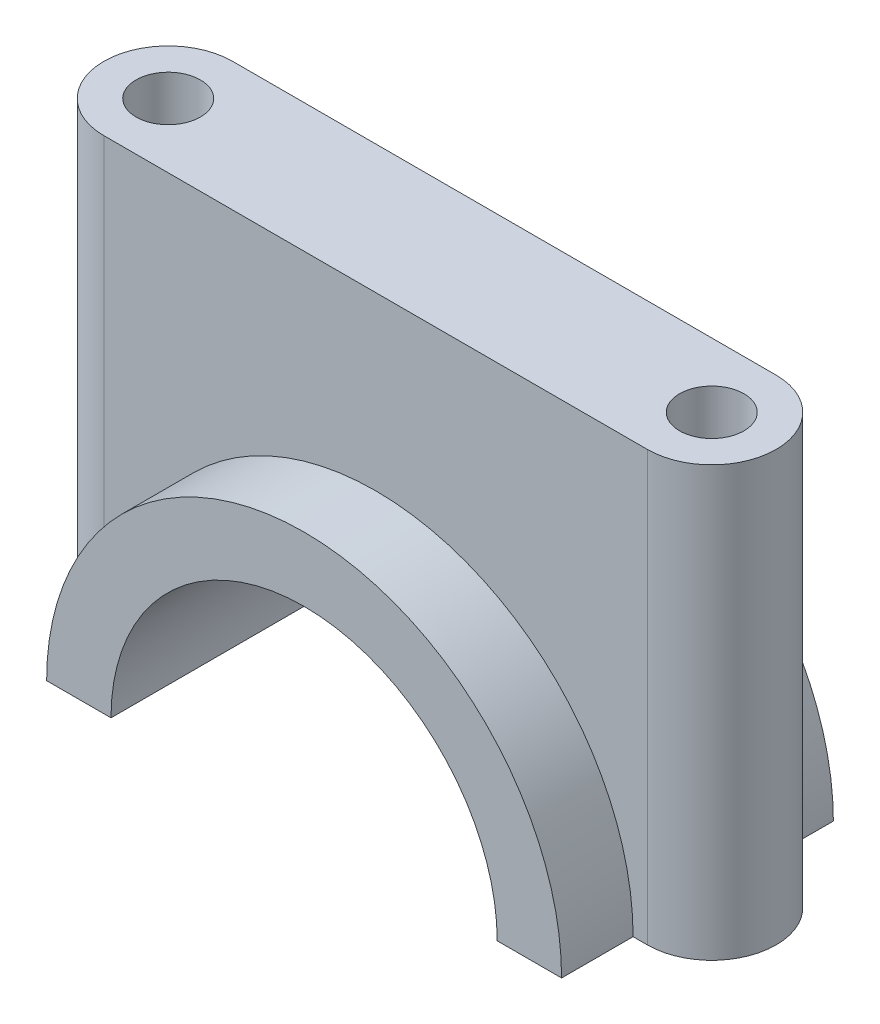
ISO-10303-21;
HEADER;
FILE_DESCRIPTION(('STEP AP214'),'2;1');
FILE_NAME('part.step','',(''),(''),'','','');
FILE_SCHEMA(('AUTOMOTIVE_DESIGN { 1 0 10303 214 1 1 1 1 }'));
ENDSEC;
DATA;
#1=APPLICATION_CONTEXT('core data for automotive mechanical design processes');
#2=APPLICATION_PROTOCOL_DEFINITION('international standard','automotive_design',2000,#1);
#3=PRODUCT_CONTEXT('',#1,'mechanical');
#4=PRODUCT('Part','Part','',(#3));
#5=PRODUCT_RELATED_PRODUCT_CATEGORY('part','',(#4));
#6=PRODUCT_DEFINITION_FORMATION('','',#4);
#7=PRODUCT_DEFINITION_CONTEXT('part definition',#1,'design');
#8=PRODUCT_DEFINITION('design','',#6,#7);
#9=PRODUCT_DEFINITION_SHAPE('','',#8);
#10=(LENGTH_UNIT() NAMED_UNIT(*) SI_UNIT(.MILLI.,.METRE.));
#11=(NAMED_UNIT(*) PLANE_ANGLE_UNIT() SI_UNIT($,.RADIAN.));
#12=(NAMED_UNIT(*) SI_UNIT($,.STERADIAN.) SOLID_ANGLE_UNIT());
#13=UNCERTAINTY_MEASURE_WITH_UNIT(LENGTH_MEASURE(1.E-05),#10,'distance_accuracy_value','');
#14=(GEOMETRIC_REPRESENTATION_CONTEXT(3) GLOBAL_UNCERTAINTY_ASSIGNED_CONTEXT((#13)) GLOBAL_UNIT_ASSIGNED_CONTEXT((#10,
#11,#12)) REPRESENTATION_CONTEXT('',''));
#15=CARTESIAN_POINT('',(0.,0.,0.));
#16=DIRECTION('',(0.,0.,1.));
#17=DIRECTION('',(1.,0.,0.));
#18=AXIS2_PLACEMENT_3D('',#15,#16,#17);
#19=CARTESIAN_POINT('',(-914.4,0.,482.6));
#20=DIRECTION('',(0.,1.,0.));
#21=DIRECTION('',(0.,0.,1.));
#22=AXIS2_PLACEMENT_3D('',#19,#20,#21);
#23=PLANE('',#22);
#24=CARTESIAN_POINT('',(965.2,0.,2.43102999324033E-13));
#25=DIRECTION('',(0.,-1.,0.));
#26=DIRECTION('',(0.,0.,-1.));
#27=AXIS2_PLACEMENT_3D('',#24,#25,#26);
#28=CIRCLE('',#27,114.3);
#29=CARTESIAN_POINT('',(965.2,0.,-114.3));
#30=VERTEX_POINT('',#29);
#31=EDGE_CURVE('E205',#30,#30,#28,.T.);
#32=ORIENTED_EDGE('',*,*,#31,.F.);
#33=EDGE_LOOP('',(#32));
#34=FACE_BOUND('',#33,.T.);
#35=DIRECTION('',(0.,0.,-1.));
#36=VECTOR('',#35,1.);
#37=CARTESIAN_POINT('',(685.8,0.,482.6));
#38=LINE('',#37,#36);
#39=CARTESIAN_POINT('',(685.8,0.,482.6));
#40=VERTEX_POINT('',#39);
#41=CARTESIAN_POINT('',(685.8,0.,-482.6));
#42=VERTEX_POINT('',#41);
#43=EDGE_CURVE('E195',#40,#42,#38,.T.);
#44=ORIENTED_EDGE('',*,*,#43,.T.);
#45=DIRECTION('',(1.,0.,0.));
#46=VECTOR('',#45,1.);
#47=CARTESIAN_POINT('',(685.8,0.,-482.6));
#48=LINE('',#47,#46);
#49=CARTESIAN_POINT('',(914.4,0.,-482.6));
#50=VERTEX_POINT('',#49);
#51=EDGE_CURVE('E180',#42,#50,#48,.T.);
#52=ORIENTED_EDGE('',*,*,#51,.T.);
#53=DIRECTION('',(0.,0.,-1.));
#54=VECTOR('',#53,1.);
#55=CARTESIAN_POINT('',(914.4,0.,482.6));
#56=LINE('',#55,#54);
#57=CARTESIAN_POINT('',(914.4,0.,-228.6));
#58=VERTEX_POINT('',#57);
#59=EDGE_CURVE('E187',#58,#50,#56,.T.);
#60=ORIENTED_EDGE('',*,*,#59,.F.);
#61=DIRECTION('',(-1.,0.,0.));
#62=VECTOR('',#61,1.);
#63=CARTESIAN_POINT('',(-965.2,-4.44089209850063E-13,-228.6));
#64=LINE('',#63,#62);
#65=CARTESIAN_POINT('',(965.2,0.,-228.6));
#66=VERTEX_POINT('',#65);
#67=EDGE_CURVE('E191',#66,#58,#64,.T.);
#68=ORIENTED_EDGE('',*,*,#67,.F.);
#69=CARTESIAN_POINT('',(965.2,0.,2.43102999324033E-13));
#70=DIRECTION('',(0.,1.,0.));
#71=DIRECTION('',(0.,0.,1.));
#72=AXIS2_PLACEMENT_3D('',#69,#70,#71);
#73=CIRCLE('',#72,228.6);
#74=CARTESIAN_POINT('',(965.2,-4.44089209850063E-13,228.6));
#75=VERTEX_POINT('',#74);
#76=EDGE_CURVE('E165',#75,#66,#73,.T.);
#77=ORIENTED_EDGE('',*,*,#76,.F.);
#78=DIRECTION('',(1.,0.,0.));
#79=VECTOR('',#78,1.);
#80=CARTESIAN_POINT('',(-965.2,-4.44089209850063E-13,228.6));
#81=LINE('',#80,#79);
#82=CARTESIAN_POINT('',(914.4,0.,228.6));
#83=VERTEX_POINT('',#82);
#84=EDGE_CURVE('E126',#83,#75,#81,.T.);
#85=ORIENTED_EDGE('',*,*,#84,.F.);
#86=CARTESIAN_POINT('',(914.4,0.,482.6));
#87=VERTEX_POINT('',#86);
#88=EDGE_CURVE('E64',#87,#83,#56,.T.);
#89=ORIENTED_EDGE('',*,*,#88,.F.);
#90=DIRECTION('',(1.,0.,0.));
#91=VECTOR('',#90,1.);
#92=CARTESIAN_POINT('',(685.8,0.,482.6));
#93=LINE('',#92,#91);
#94=EDGE_CURVE('E167',#40,#87,#93,.T.);
#95=ORIENTED_EDGE('',*,*,#94,.F.);
#96=EDGE_LOOP('',(#44,#52,#60,#68,#77,#85,#89,#95));
#97=FACE_BOUND('',#96,.T.);
#98=ADVANCED_FACE('F39',(#34,#97),#23,.F.);
#99=CARTESIAN_POINT('',(0.,0.,482.6));
#100=DIRECTION('',(0.,0.,-1.));
#101=DIRECTION('',(-1.,0.,0.));
#102=AXIS2_PLACEMENT_3D('',#99,#100,#101);
#103=CYLINDRICAL_SURFACE('',#102,685.8);
#104=CARTESIAN_POINT('',(0.,0.,-482.6));
#105=DIRECTION('',(0.,0.,-1.));
#106=DIRECTION('',(1.,0.,0.));
#107=AXIS2_PLACEMENT_3D('',#104,#105,#106);
#108=CIRCLE('',#107,685.8);
#109=CARTESIAN_POINT('',(-685.8,0.,-482.6));
#110=VERTEX_POINT('',#109);
#111=EDGE_CURVE('E173',#110,#42,#108,.T.);
#112=ORIENTED_EDGE('',*,*,#111,.T.);
#113=ORIENTED_EDGE('',*,*,#43,.F.);
#114=CARTESIAN_POINT('',(0.,0.,482.6));
#115=DIRECTION('',(0.,0.,-1.));
#116=DIRECTION('',(1.,0.,0.));
#117=AXIS2_PLACEMENT_3D('',#114,#115,#116);
#118=CIRCLE('',#117,685.8);
#119=CARTESIAN_POINT('',(-685.8,0.,482.6));
#120=VERTEX_POINT('',#119);
#121=EDGE_CURVE('E162',#120,#40,#118,.T.);
#122=ORIENTED_EDGE('',*,*,#121,.F.);
#123=DIRECTION('',(0.,0.,-1.));
#124=VECTOR('',#123,1.);
#125=CARTESIAN_POINT('',(-685.8,0.,482.6));
#126=LINE('',#125,#124);
#127=EDGE_CURVE('E175',#120,#110,#126,.T.);
#128=ORIENTED_EDGE('',*,*,#127,.T.);
#129=EDGE_LOOP('',(#112,#113,#122,#128));
#130=FACE_BOUND('',#129,.T.);
#131=ADVANCED_FACE('F41',(#130),#103,.F.);
#132=CARTESIAN_POINT('',(0.,0.,482.6));
#133=DIRECTION('',(0.,0.,-1.));
#134=DIRECTION('',(-1.,0.,0.));
#135=AXIS2_PLACEMENT_3D('',#132,#133,#134);
#136=CYLINDRICAL_SURFACE('',#135,914.4);
#137=CARTESIAN_POINT('',(0.,0.,228.6));
#138=DIRECTION('',(0.,0.,-1.));
#139=DIRECTION('',(-1.,0.,0.));
#140=AXIS2_PLACEMENT_3D('',#137,#138,#139);
#141=CIRCLE('',#140,914.4);
#142=CARTESIAN_POINT('',(-914.4,0.,228.6));
#143=VERTEX_POINT('',#142);
#144=EDGE_CURVE('E11',#143,#83,#141,.T.);
#145=ORIENTED_EDGE('',*,*,#144,.F.);
#146=DIRECTION('',(0.,0.,-1.));
#147=VECTOR('',#146,1.);
#148=CARTESIAN_POINT('',(-914.4,0.,482.6));
#149=LINE('',#148,#147);
#150=CARTESIAN_POINT('',(-914.4,0.,482.6));
#151=VERTEX_POINT('',#150);
#152=EDGE_CURVE('E186',#151,#143,#149,.T.);
#153=ORIENTED_EDGE('',*,*,#152,.F.);
#154=CARTESIAN_POINT('',(0.,0.,482.6));
#155=DIRECTION('',(0.,0.,1.));
#156=DIRECTION('',(1.,0.,0.));
#157=AXIS2_PLACEMENT_3D('',#154,#155,#156);
#158=CIRCLE('',#157,914.4);
#159=EDGE_CURVE('E166',#87,#151,#158,.T.);
#160=ORIENTED_EDGE('',*,*,#159,.F.);
#161=ORIENTED_EDGE('',*,*,#88,.T.);
#162=EDGE_LOOP('',(#145,#153,#160,#161));
#163=FACE_BOUND('',#162,.T.);
#164=ADVANCED_FACE('F224',(#163),#136,.T.);
#165=CARTESIAN_POINT('',(0.,0.,-228.6));
#166=DIRECTION('',(0.,0.,1.));
#167=DIRECTION('',(1.,0.,0.));
#168=AXIS2_PLACEMENT_3D('',#165,#166,#167);
#169=CIRCLE('',#168,914.4);
#170=CARTESIAN_POINT('',(-914.4,-4.44089209850063E-13,-228.6));
#171=VERTEX_POINT('',#170);
#172=EDGE_CURVE('E50',#58,#171,#169,.T.);
#173=ORIENTED_EDGE('',*,*,#172,.F.);
#174=ORIENTED_EDGE('',*,*,#59,.T.);
#175=CARTESIAN_POINT('',(0.,0.,-482.6));
#176=DIRECTION('',(0.,0.,1.));
#177=DIRECTION('',(1.,0.,0.));
#178=AXIS2_PLACEMENT_3D('',#175,#176,#177);
#179=CIRCLE('',#178,914.4);
#180=CARTESIAN_POINT('',(-914.4,0.,-482.6));
#181=VERTEX_POINT('',#180);
#182=EDGE_CURVE('E179',#50,#181,#179,.T.);
#183=ORIENTED_EDGE('',*,*,#182,.T.);
#184=EDGE_CURVE('E189',#171,#181,#149,.T.);
#185=ORIENTED_EDGE('',*,*,#184,.F.);
#186=EDGE_LOOP('',(#173,#174,#183,#185));
#187=FACE_BOUND('',#186,.T.);
#188=ADVANCED_FACE('F215',(#187),#136,.T.);
#189=CARTESIAN_POINT('',(-965.2,0.,-3.4791154594448E-13));
#190=DIRECTION('',(0.,-1.,0.));
#191=DIRECTION('',(0.,0.,-1.));
#192=AXIS2_PLACEMENT_3D('',#189,#190,#191);
#193=CIRCLE('',#192,114.3);
#194=CARTESIAN_POINT('',(-965.2,0.,-114.3));
#195=VERTEX_POINT('',#194);
#196=EDGE_CURVE('E148',#195,#195,#193,.T.);
#197=ORIENTED_EDGE('',*,*,#196,.F.);
#198=EDGE_LOOP('',(#197));
#199=FACE_BOUND('',#198,.T.);
#200=DIRECTION('',(1.,0.,0.));
#201=VECTOR('',#200,1.);
#202=CARTESIAN_POINT('',(-914.4,0.,-482.6));
#203=LINE('',#202,#201);
#204=EDGE_CURVE('E170',#181,#110,#203,.T.);
#205=ORIENTED_EDGE('',*,*,#204,.T.);
#206=ORIENTED_EDGE('',*,*,#127,.F.);
#207=DIRECTION('',(1.,0.,0.));
#208=VECTOR('',#207,1.);
#209=CARTESIAN_POINT('',(-914.4,0.,482.6));
#210=LINE('',#209,#208);
#211=EDGE_CURVE('E174',#151,#120,#210,.T.);
#212=ORIENTED_EDGE('',*,*,#211,.F.);
#213=ORIENTED_EDGE('',*,*,#152,.T.);
#214=CARTESIAN_POINT('',(-965.2,-4.44089209850063E-13,228.6));
#215=VERTEX_POINT('',#214);
#216=EDGE_CURVE('E157',#215,#143,#81,.T.);
#217=ORIENTED_EDGE('',*,*,#216,.F.);
#218=CARTESIAN_POINT('',(-965.2,0.,-3.4791154594448E-13));
#219=DIRECTION('',(0.,1.,0.));
#220=DIRECTION('',(0.,0.,1.));
#221=AXIS2_PLACEMENT_3D('',#218,#219,#220);
#222=CIRCLE('',#221,228.6);
#223=CARTESIAN_POINT('',(-965.2,-4.44089209850063E-13,-228.6));
#224=VERTEX_POINT('',#223);
#225=EDGE_CURVE('E149',#224,#215,#222,.T.);
#226=ORIENTED_EDGE('',*,*,#225,.F.);
#227=EDGE_CURVE('E121',#171,#224,#64,.T.);
#228=ORIENTED_EDGE('',*,*,#227,.F.);
#229=ORIENTED_EDGE('',*,*,#184,.T.);
#230=EDGE_LOOP('',(#205,#206,#212,#213,#217,#226,#228,#229));
#231=FACE_BOUND('',#230,.T.);
#232=ADVANCED_FACE('F194',(#199,#231),#23,.F.);
#233=CARTESIAN_POINT('',(0.,0.,482.6));
#234=DIRECTION('',(0.,0.,1.));
#235=DIRECTION('',(1.,0.,0.));
#236=AXIS2_PLACEMENT_3D('',#233,#234,#235);
#237=PLANE('',#236);
#238=ORIENTED_EDGE('',*,*,#121,.T.);
#239=ORIENTED_EDGE('',*,*,#94,.T.);
#240=ORIENTED_EDGE('',*,*,#159,.T.);
#241=ORIENTED_EDGE('',*,*,#211,.T.);
#242=EDGE_LOOP('',(#238,#239,#240,#241));
#243=FACE_BOUND('',#242,.T.);
#244=ADVANCED_FACE('F211',(#243),#237,.T.);
#245=CARTESIAN_POINT('',(0.,0.,-482.6));
#246=DIRECTION('',(0.,0.,1.));
#247=DIRECTION('',(1.,0.,0.));
#248=AXIS2_PLACEMENT_3D('',#245,#246,#247);
#249=PLANE('',#248);
#250=ORIENTED_EDGE('',*,*,#111,.F.);
#251=ORIENTED_EDGE('',*,*,#204,.F.);
#252=ORIENTED_EDGE('',*,*,#182,.F.);
#253=ORIENTED_EDGE('',*,*,#51,.F.);
#254=EDGE_LOOP('',(#250,#251,#252,#253));
#255=FACE_BOUND('',#254,.T.);
#256=ADVANCED_FACE('F218',(#255),#249,.F.);
#257=CARTESIAN_POINT('',(-965.2,-2430.9803783659,-3.4791154594448E-13));
#258=DIRECTION('',(0.,1.,0.));
#259=DIRECTION('',(0.,0.,1.));
#260=AXIS2_PLACEMENT_3D('',#257,#258,#259);
#261=CYLINDRICAL_SURFACE('',#260,228.6);
#262=DIRECTION('',(0.,1.,0.));
#263=VECTOR('',#262,1.);
#264=CARTESIAN_POINT('',(-965.2,-2430.9803783659,-228.6));
#265=LINE('',#264,#263);
#266=CARTESIAN_POINT('',(-965.2,1524.,-228.6));
#267=VERTEX_POINT('',#266);
#268=EDGE_CURVE('E113',#224,#267,#265,.T.);
#269=ORIENTED_EDGE('',*,*,#268,.F.);
#270=ORIENTED_EDGE('',*,*,#225,.T.);
#271=DIRECTION('',(0.,1.,0.));
#272=VECTOR('',#271,1.);
#273=CARTESIAN_POINT('',(-965.2,-2430.9803783659,228.6));
#274=LINE('',#273,#272);
#275=CARTESIAN_POINT('',(-965.2,1524.,228.6));
#276=VERTEX_POINT('',#275);
#277=EDGE_CURVE('E143',#215,#276,#274,.T.);
#278=ORIENTED_EDGE('',*,*,#277,.T.);
#279=CARTESIAN_POINT('',(-965.2,1524.,-3.4791154594448E-13));
#280=DIRECTION('',(0.,-1.,0.));
#281=DIRECTION('',(0.,0.,-1.));
#282=AXIS2_PLACEMENT_3D('',#279,#280,#281);
#283=CIRCLE('',#282,228.6);
#284=EDGE_CURVE('E132',#276,#267,#283,.T.);
#285=ORIENTED_EDGE('',*,*,#284,.T.);
#286=EDGE_LOOP('',(#269,#270,#278,#285));
#287=FACE_BOUND('',#286,.T.);
#288=ADVANCED_FACE('F137',(#287),#261,.T.);
#289=CARTESIAN_POINT('',(-965.2,-2430.9803783659,-228.6));
#290=DIRECTION('',(0.,0.,1.));
#291=DIRECTION('',(1.,0.,0.));
#292=AXIS2_PLACEMENT_3D('',#289,#290,#291);
#293=PLANE('',#292);
#294=ORIENTED_EDGE('',*,*,#67,.T.);
#295=ORIENTED_EDGE('',*,*,#172,.T.);
#296=ORIENTED_EDGE('',*,*,#227,.T.);
#297=ORIENTED_EDGE('',*,*,#268,.T.);
#298=DIRECTION('',(1.,0.,0.));
#299=VECTOR('',#298,1.);
#300=CARTESIAN_POINT('',(-965.2,1524.,-228.6));
#301=LINE('',#300,#299);
#302=CARTESIAN_POINT('',(965.2,1524.,-228.6));
#303=VERTEX_POINT('',#302);
#304=EDGE_CURVE('E117',#267,#303,#301,.T.);
#305=ORIENTED_EDGE('',*,*,#304,.T.);
#306=DIRECTION('',(0.,1.,0.));
#307=VECTOR('',#306,1.);
#308=CARTESIAN_POINT('',(965.2,-2430.9803783659,-228.6));
#309=LINE('',#308,#307);
#310=EDGE_CURVE('E129',#66,#303,#309,.T.);
#311=ORIENTED_EDGE('',*,*,#310,.F.);
#312=EDGE_LOOP('',(#294,#295,#296,#297,#305,#311));
#313=FACE_BOUND('',#312,.T.);
#314=ADVANCED_FACE('F120',(#313),#293,.F.);
#315=CARTESIAN_POINT('',(965.2,-2430.9803783659,2.43102999324033E-13));
#316=DIRECTION('',(0.,1.,0.));
#317=DIRECTION('',(0.,0.,1.));
#318=AXIS2_PLACEMENT_3D('',#315,#316,#317);
#319=CYLINDRICAL_SURFACE('',#318,228.6);
#320=DIRECTION('',(0.,1.,0.));
#321=VECTOR('',#320,1.);
#322=CARTESIAN_POINT('',(965.2,-2430.9803783659,228.6));
#323=LINE('',#322,#321);
#324=CARTESIAN_POINT('',(965.2,1524.,228.6));
#325=VERTEX_POINT('',#324);
#326=EDGE_CURVE('E156',#75,#325,#323,.T.);
#327=ORIENTED_EDGE('',*,*,#326,.F.);
#328=ORIENTED_EDGE('',*,*,#76,.T.);
#329=ORIENTED_EDGE('',*,*,#310,.T.);
#330=CARTESIAN_POINT('',(965.2,1524.,2.43102999324033E-13));
#331=DIRECTION('',(0.,-1.,0.));
#332=DIRECTION('',(0.,0.,-1.));
#333=AXIS2_PLACEMENT_3D('',#330,#331,#332);
#334=CIRCLE('',#333,228.6);
#335=EDGE_CURVE('E140',#303,#325,#334,.T.);
#336=ORIENTED_EDGE('',*,*,#335,.T.);
#337=EDGE_LOOP('',(#327,#328,#329,#336));
#338=FACE_BOUND('',#337,.T.);
#339=ADVANCED_FACE('F246',(#338),#319,.T.);
#340=CARTESIAN_POINT('',(-965.2,-2430.9803783659,228.6));
#341=DIRECTION('',(0.,0.,-1.));
#342=DIRECTION('',(-1.,0.,0.));
#343=AXIS2_PLACEMENT_3D('',#340,#341,#342);
#344=PLANE('',#343);
#345=ORIENTED_EDGE('',*,*,#216,.T.);
#346=ORIENTED_EDGE('',*,*,#144,.T.);
#347=ORIENTED_EDGE('',*,*,#84,.T.);
#348=ORIENTED_EDGE('',*,*,#326,.T.);
#349=DIRECTION('',(-1.,0.,0.));
#350=VECTOR('',#349,1.);
#351=CARTESIAN_POINT('',(-965.2,1524.,228.6));
#352=LINE('',#351,#350);
#353=EDGE_CURVE('E153',#325,#276,#352,.T.);
#354=ORIENTED_EDGE('',*,*,#353,.T.);
#355=ORIENTED_EDGE('',*,*,#277,.F.);
#356=EDGE_LOOP('',(#345,#346,#347,#348,#354,#355));
#357=FACE_BOUND('',#356,.T.);
#358=ADVANCED_FACE('F243',(#357),#344,.F.);
#359=CARTESIAN_POINT('',(-965.2,1524.,-3.4791154594448E-13));
#360=DIRECTION('',(0.,-1.,0.));
#361=DIRECTION('',(0.,0.,-1.));
#362=AXIS2_PLACEMENT_3D('',#359,#360,#361);
#363=PLANE('',#362);
#364=CARTESIAN_POINT('',(-965.2,1524.,-3.4791154594448E-13));
#365=DIRECTION('',(0.,-1.,0.));
#366=DIRECTION('',(0.,0.,-1.));
#367=AXIS2_PLACEMENT_3D('',#364,#365,#366);
#368=CIRCLE('',#367,114.3);
#369=CARTESIAN_POINT('',(-965.2,1524.,-114.3));
#370=VERTEX_POINT('',#369);
#371=EDGE_CURVE('E141',#370,#370,#368,.T.);
#372=ORIENTED_EDGE('',*,*,#371,.T.);
#373=EDGE_LOOP('',(#372));
#374=FACE_BOUND('',#373,.T.);
#375=CARTESIAN_POINT('',(965.2,1524.,2.43102999324033E-13));
#376=DIRECTION('',(0.,-1.,0.));
#377=DIRECTION('',(0.,0.,-1.));
#378=AXIS2_PLACEMENT_3D('',#375,#376,#377);
#379=CIRCLE('',#378,114.3);
#380=CARTESIAN_POINT('',(965.2,1524.,-114.3));
#381=VERTEX_POINT('',#380);
#382=EDGE_CURVE('E200',#381,#381,#379,.T.);
#383=ORIENTED_EDGE('',*,*,#382,.T.);
#384=EDGE_LOOP('',(#383));
#385=FACE_BOUND('',#384,.T.);
#386=ORIENTED_EDGE('',*,*,#284,.F.);
#387=ORIENTED_EDGE('',*,*,#353,.F.);
#388=ORIENTED_EDGE('',*,*,#335,.F.);
#389=ORIENTED_EDGE('',*,*,#304,.F.);
#390=EDGE_LOOP('',(#386,#387,#388,#389));
#391=FACE_BOUND('',#390,.T.);
#392=ADVANCED_FACE('F135',(#374,#385,#391),#363,.F.);
#393=CARTESIAN_POINT('',(965.2,1524.,2.43102999324033E-13));
#394=DIRECTION('',(0.,-1.,0.));
#395=DIRECTION('',(0.,0.,-1.));
#396=AXIS2_PLACEMENT_3D('',#393,#394,#395);
#397=CYLINDRICAL_SURFACE('',#396,114.3);
#398=ORIENTED_EDGE('',*,*,#382,.F.);
#399=EDGE_LOOP('',(#398));
#400=FACE_BOUND('',#399,.T.);
#401=ORIENTED_EDGE('',*,*,#31,.T.);
#402=EDGE_LOOP('',(#401));
#403=FACE_BOUND('',#402,.T.);
#404=ADVANCED_FACE('F302',(#400,#403),#397,.F.);
#405=CARTESIAN_POINT('',(-965.2,1524.,-3.4791154594448E-13));
#406=DIRECTION('',(0.,-1.,0.));
#407=DIRECTION('',(0.,0.,-1.));
#408=AXIS2_PLACEMENT_3D('',#405,#406,#407);
#409=CYLINDRICAL_SURFACE('',#408,114.3);
#410=ORIENTED_EDGE('',*,*,#371,.F.);
#411=EDGE_LOOP('',(#410));
#412=FACE_BOUND('',#411,.T.);
#413=ORIENTED_EDGE('',*,*,#196,.T.);
#414=EDGE_LOOP('',(#413));
#415=FACE_BOUND('',#414,.T.);
#416=ADVANCED_FACE('F208',(#412,#415),#409,.F.);
#417=CLOSED_SHELL('',(#98,#131,#164,#188,#232,#244,#256,#288,#314,#339,#358,#392,#404,#416));
#418=MANIFOLD_SOLID_BREP('B2',#417);
#419=ADVANCED_BREP_SHAPE_REPRESENTATION('',(#18,#418),#14);
#420=SHAPE_DEFINITION_REPRESENTATION(#9,#419);
ENDSEC;
END-ISO-10303-21;
